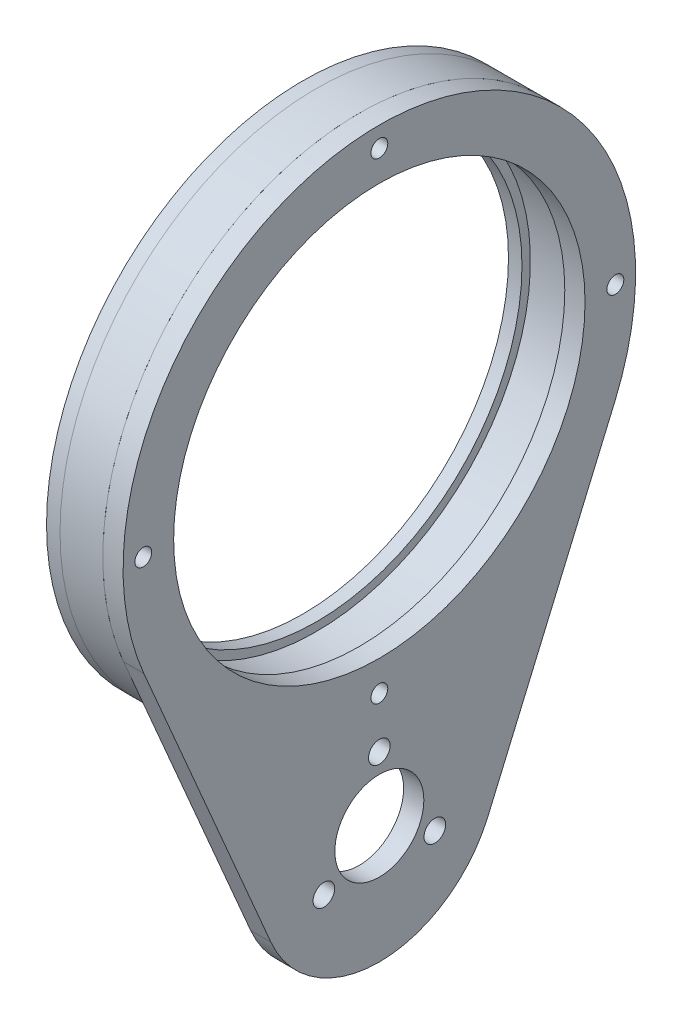
ISO-10303-21;
HEADER;
FILE_DESCRIPTION(('STEP AP214'),'2;1');
FILE_NAME('part.step','',(''),(''),'','','');
FILE_SCHEMA(('AUTOMOTIVE_DESIGN { 1 0 10303 214 1 1 1 1 }'));
ENDSEC;
DATA;
#1=APPLICATION_CONTEXT('core data for automotive mechanical design processes');
#2=APPLICATION_PROTOCOL_DEFINITION('international standard','automotive_design',2000,#1);
#3=PRODUCT_CONTEXT('',#1,'mechanical');
#4=PRODUCT('Part','Part','',(#3));
#5=PRODUCT_RELATED_PRODUCT_CATEGORY('part','',(#4));
#6=PRODUCT_DEFINITION_FORMATION('','',#4);
#7=PRODUCT_DEFINITION_CONTEXT('part definition',#1,'design');
#8=PRODUCT_DEFINITION('design','',#6,#7);
#9=PRODUCT_DEFINITION_SHAPE('','',#8);
#10=(LENGTH_UNIT() NAMED_UNIT(*) SI_UNIT(.MILLI.,.METRE.));
#11=(NAMED_UNIT(*) PLANE_ANGLE_UNIT() SI_UNIT($,.RADIAN.));
#12=(NAMED_UNIT(*) SI_UNIT($,.STERADIAN.) SOLID_ANGLE_UNIT());
#13=UNCERTAINTY_MEASURE_WITH_UNIT(LENGTH_MEASURE(1.E-05),#10,'distance_accuracy_value','');
#14=(GEOMETRIC_REPRESENTATION_CONTEXT(3) GLOBAL_UNCERTAINTY_ASSIGNED_CONTEXT((#13)) GLOBAL_UNIT_ASSIGNED_CONTEXT((#10,
#11,#12)) REPRESENTATION_CONTEXT('',''));
#15=CARTESIAN_POINT('',(0.,0.,0.));
#16=DIRECTION('',(0.,0.,1.));
#17=DIRECTION('',(1.,0.,0.));
#18=AXIS2_PLACEMENT_3D('',#15,#16,#17);
#19=CARTESIAN_POINT('',(-8.35,52.,0.));
#20=DIRECTION('',(-1.,0.,0.));
#21=DIRECTION('',(0.,0.,1.));
#22=AXIS2_PLACEMENT_3D('',#19,#20,#21);
#23=PLANE('',#22);
#24=CARTESIAN_POINT('',(-8.35,52.,-35.));
#25=DIRECTION('',(-1.,0.,0.));
#26=DIRECTION('',(0.,0.,1.));
#27=AXIS2_PLACEMENT_3D('',#24,#25,#26);
#28=CIRCLE('',#27,1.60000000000001);
#29=CARTESIAN_POINT('',(-8.35,52.,-33.4));
#30=VERTEX_POINT('',#29);
#31=EDGE_CURVE('E74',#30,#30,#28,.T.);
#32=ORIENTED_EDGE('',*,*,#31,.F.);
#33=EDGE_LOOP('',(#32));
#34=FACE_BOUND('',#33,.T.);
#35=CARTESIAN_POINT('',(-8.35,17.,0.));
#36=DIRECTION('',(-1.,0.,0.));
#37=DIRECTION('',(0.,0.,1.));
#38=AXIS2_PLACEMENT_3D('',#35,#36,#37);
#39=CIRCLE('',#38,1.6);
#40=CARTESIAN_POINT('',(-8.35,17.,1.6));
#41=VERTEX_POINT('',#40);
#42=EDGE_CURVE('E62',#41,#41,#39,.T.);
#43=ORIENTED_EDGE('',*,*,#42,.F.);
#44=EDGE_LOOP('',(#43));
#45=FACE_BOUND('',#44,.T.);
#46=CARTESIAN_POINT('',(-8.35,52.,0.));
#47=DIRECTION('',(-1.,0.,0.));
#48=DIRECTION('',(0.,0.,1.));
#49=AXIS2_PLACEMENT_3D('',#46,#47,#48);
#50=CIRCLE('',#49,38.);
#51=CARTESIAN_POINT('',(-8.35,52.,38.));
#52=VERTEX_POINT('',#51);
#53=EDGE_CURVE('E11',#52,#52,#50,.T.);
#54=ORIENTED_EDGE('',*,*,#53,.T.);
#55=EDGE_LOOP('',(#54));
#56=FACE_BOUND('',#55,.T.);
#57=CARTESIAN_POINT('',(-8.35,52.,0.));
#58=DIRECTION('',(-1.,0.,0.));
#59=DIRECTION('',(0.,0.,1.));
#60=AXIS2_PLACEMENT_3D('',#57,#58,#59);
#61=CIRCLE('',#60,30.5);
#62=CARTESIAN_POINT('',(-8.35,52.,30.5));
#63=VERTEX_POINT('',#62);
#64=EDGE_CURVE('E57',#63,#63,#61,.T.);
#65=ORIENTED_EDGE('',*,*,#64,.F.);
#66=EDGE_LOOP('',(#65));
#67=FACE_BOUND('',#66,.T.);
#68=CARTESIAN_POINT('',(-8.35,52.,35.));
#69=DIRECTION('',(-1.,0.,0.));
#70=DIRECTION('',(0.,0.,1.));
#71=AXIS2_PLACEMENT_3D('',#68,#69,#70);
#72=CIRCLE('',#71,1.60000000000001);
#73=CARTESIAN_POINT('',(-8.35,52.,36.6));
#74=VERTEX_POINT('',#73);
#75=EDGE_CURVE('E68',#74,#74,#72,.T.);
#76=ORIENTED_EDGE('',*,*,#75,.F.);
#77=EDGE_LOOP('',(#76));
#78=FACE_BOUND('',#77,.T.);
#79=CARTESIAN_POINT('',(-8.35,87.,0.));
#80=DIRECTION('',(-1.,0.,0.));
#81=DIRECTION('',(0.,0.,1.));
#82=AXIS2_PLACEMENT_3D('',#79,#80,#81);
#83=CIRCLE('',#82,1.60000000000001);
#84=CARTESIAN_POINT('',(-8.35,87.,1.60000000000001));
#85=VERTEX_POINT('',#84);
#86=EDGE_CURVE('E80',#85,#85,#83,.T.);
#87=ORIENTED_EDGE('',*,*,#86,.F.);
#88=EDGE_LOOP('',(#87));
#89=FACE_BOUND('',#88,.T.);
#90=ADVANCED_FACE('F46',(#34,#45,#56,#67,#78,#89),#23,.T.);
#91=CARTESIAN_POINT('',(-6.35,52.,0.));
#92=DIRECTION('',(-1.,0.,0.));
#93=DIRECTION('',(0.,0.,1.));
#94=AXIS2_PLACEMENT_3D('',#91,#92,#93);
#95=PLANE('',#94);
#96=CARTESIAN_POINT('',(-6.35,52.,0.));
#97=DIRECTION('',(-1.,0.,0.));
#98=DIRECTION('',(0.,0.,1.));
#99=AXIS2_PLACEMENT_3D('',#96,#97,#98);
#100=CIRCLE('',#99,38.);
#101=CARTESIAN_POINT('',(-6.35,52.,38.));
#102=VERTEX_POINT('',#101);
#103=EDGE_CURVE('E50',#102,#102,#100,.T.);
#104=ORIENTED_EDGE('',*,*,#103,.F.);
#105=EDGE_LOOP('',(#104));
#106=FACE_BOUND('',#105,.T.);
#107=CARTESIAN_POINT('',(-6.35,52.,0.));
#108=DIRECTION('',(-1.,0.,0.));
#109=DIRECTION('',(0.,0.,1.));
#110=AXIS2_PLACEMENT_3D('',#107,#108,#109);
#111=CIRCLE('',#110,30.5);
#112=CARTESIAN_POINT('',(-6.35,52.,30.5));
#113=VERTEX_POINT('',#112);
#114=EDGE_CURVE('E59',#113,#113,#111,.T.);
#115=ORIENTED_EDGE('',*,*,#114,.T.);
#116=EDGE_LOOP('',(#115));
#117=FACE_BOUND('',#116,.T.);
#118=CARTESIAN_POINT('',(-6.35,17.,0.));
#119=DIRECTION('',(-1.,0.,0.));
#120=DIRECTION('',(0.,0.,1.));
#121=AXIS2_PLACEMENT_3D('',#118,#119,#120);
#122=CIRCLE('',#121,1.6);
#123=CARTESIAN_POINT('',(-6.35,17.,1.6));
#124=VERTEX_POINT('',#123);
#125=EDGE_CURVE('E65',#124,#124,#122,.T.);
#126=ORIENTED_EDGE('',*,*,#125,.T.);
#127=EDGE_LOOP('',(#126));
#128=FACE_BOUND('',#127,.T.);
#129=CARTESIAN_POINT('',(-6.35,52.,35.));
#130=DIRECTION('',(-1.,0.,0.));
#131=DIRECTION('',(0.,0.,1.));
#132=AXIS2_PLACEMENT_3D('',#129,#130,#131);
#133=CIRCLE('',#132,1.60000000000001);
#134=CARTESIAN_POINT('',(-6.35,52.,36.6));
#135=VERTEX_POINT('',#134);
#136=EDGE_CURVE('E71',#135,#135,#133,.T.);
#137=ORIENTED_EDGE('',*,*,#136,.T.);
#138=EDGE_LOOP('',(#137));
#139=FACE_BOUND('',#138,.T.);
#140=CARTESIAN_POINT('',(-6.35,52.,-35.));
#141=DIRECTION('',(-1.,0.,0.));
#142=DIRECTION('',(0.,0.,1.));
#143=AXIS2_PLACEMENT_3D('',#140,#141,#142);
#144=CIRCLE('',#143,1.60000000000001);
#145=CARTESIAN_POINT('',(-6.35,52.,-33.4));
#146=VERTEX_POINT('',#145);
#147=EDGE_CURVE('E77',#146,#146,#144,.T.);
#148=ORIENTED_EDGE('',*,*,#147,.T.);
#149=EDGE_LOOP('',(#148));
#150=FACE_BOUND('',#149,.T.);
#151=CARTESIAN_POINT('',(-6.35,87.,0.));
#152=DIRECTION('',(-1.,0.,0.));
#153=DIRECTION('',(0.,0.,1.));
#154=AXIS2_PLACEMENT_3D('',#151,#152,#153);
#155=CIRCLE('',#154,1.60000000000001);
#156=CARTESIAN_POINT('',(-6.35,87.,1.60000000000001));
#157=VERTEX_POINT('',#156);
#158=EDGE_CURVE('E83',#157,#157,#155,.T.);
#159=ORIENTED_EDGE('',*,*,#158,.T.);
#160=EDGE_LOOP('',(#159));
#161=FACE_BOUND('',#160,.T.);
#162=ADVANCED_FACE('F93',(#106,#117,#128,#139,#150,#161),#95,.F.);
#163=CARTESIAN_POINT('',(-8.35,52.,0.));
#164=DIRECTION('',(1.,0.,0.));
#165=DIRECTION('',(0.,0.,-1.));
#166=AXIS2_PLACEMENT_3D('',#163,#164,#165);
#167=CYLINDRICAL_SURFACE('',#166,38.);
#168=ORIENTED_EDGE('',*,*,#53,.F.);
#169=EDGE_LOOP('',(#168));
#170=FACE_BOUND('',#169,.T.);
#171=ORIENTED_EDGE('',*,*,#103,.T.);
#172=EDGE_LOOP('',(#171));
#173=FACE_BOUND('',#172,.T.);
#174=ADVANCED_FACE('F48',(#170,#173),#167,.T.);
#175=CARTESIAN_POINT('',(-8.35,52.,0.));
#176=DIRECTION('',(1.,0.,0.));
#177=DIRECTION('',(0.,0.,-1.));
#178=AXIS2_PLACEMENT_3D('',#175,#176,#177);
#179=CYLINDRICAL_SURFACE('',#178,30.5);
#180=ORIENTED_EDGE('',*,*,#64,.T.);
#181=EDGE_LOOP('',(#180));
#182=FACE_BOUND('',#181,.T.);
#183=ORIENTED_EDGE('',*,*,#114,.F.);
#184=EDGE_LOOP('',(#183));
#185=FACE_BOUND('',#184,.T.);
#186=ADVANCED_FACE('F103',(#182,#185),#179,.F.);
#187=CARTESIAN_POINT('',(-8.35,17.,0.));
#188=DIRECTION('',(1.,0.,0.));
#189=DIRECTION('',(0.,0.,-1.));
#190=AXIS2_PLACEMENT_3D('',#187,#188,#189);
#191=CYLINDRICAL_SURFACE('',#190,1.6);
#192=ORIENTED_EDGE('',*,*,#42,.T.);
#193=EDGE_LOOP('',(#192));
#194=FACE_BOUND('',#193,.T.);
#195=ORIENTED_EDGE('',*,*,#125,.F.);
#196=EDGE_LOOP('',(#195));
#197=FACE_BOUND('',#196,.T.);
#198=ADVANCED_FACE('F106',(#194,#197),#191,.F.);
#199=CARTESIAN_POINT('',(-8.35,52.,35.));
#200=DIRECTION('',(1.,0.,0.));
#201=DIRECTION('',(0.,0.,-1.));
#202=AXIS2_PLACEMENT_3D('',#199,#200,#201);
#203=CYLINDRICAL_SURFACE('',#202,1.60000000000001);
#204=ORIENTED_EDGE('',*,*,#75,.T.);
#205=EDGE_LOOP('',(#204));
#206=FACE_BOUND('',#205,.T.);
#207=ORIENTED_EDGE('',*,*,#136,.F.);
#208=EDGE_LOOP('',(#207));
#209=FACE_BOUND('',#208,.T.);
#210=ADVANCED_FACE('F110',(#206,#209),#203,.F.);
#211=CARTESIAN_POINT('',(-8.35,52.,-35.));
#212=DIRECTION('',(1.,0.,0.));
#213=DIRECTION('',(0.,0.,-1.));
#214=AXIS2_PLACEMENT_3D('',#211,#212,#213);
#215=CYLINDRICAL_SURFACE('',#214,1.60000000000001);
#216=ORIENTED_EDGE('',*,*,#31,.T.);
#217=EDGE_LOOP('',(#216));
#218=FACE_BOUND('',#217,.T.);
#219=ORIENTED_EDGE('',*,*,#147,.F.);
#220=EDGE_LOOP('',(#219));
#221=FACE_BOUND('',#220,.T.);
#222=ADVANCED_FACE('F114',(#218,#221),#215,.F.);
#223=CARTESIAN_POINT('',(-8.35,87.,0.));
#224=DIRECTION('',(1.,0.,0.));
#225=DIRECTION('',(0.,0.,-1.));
#226=AXIS2_PLACEMENT_3D('',#223,#224,#225);
#227=CYLINDRICAL_SURFACE('',#226,1.60000000000001);
#228=ORIENTED_EDGE('',*,*,#86,.T.);
#229=EDGE_LOOP('',(#228));
#230=FACE_BOUND('',#229,.T.);
#231=ORIENTED_EDGE('',*,*,#158,.F.);
#232=EDGE_LOOP('',(#231));
#233=FACE_BOUND('',#232,.T.);
#234=ADVANCED_FACE('F89',(#230,#233),#227,.F.);
#235=CLOSED_SHELL('',(#90,#162,#174,#186,#198,#210,#222,#234));
#236=MANIFOLD_SOLID_BREP('B2',#235);
#237=CARTESIAN_POINT('',(-6.35,52.,0.));
#238=DIRECTION('',(-1.,0.,0.));
#239=DIRECTION('',(0.,0.,1.));
#240=AXIS2_PLACEMENT_3D('',#237,#238,#239);
#241=PLANE('',#240);
#242=CARTESIAN_POINT('',(-6.35,17.,0.));
#243=DIRECTION('',(-1.,0.,0.));
#244=DIRECTION('',(0.,0.,1.));
#245=AXIS2_PLACEMENT_3D('',#242,#243,#244);
#246=CIRCLE('',#245,1.6);
#247=CARTESIAN_POINT('',(-6.35,17.,1.6));
#248=VERTEX_POINT('',#247);
#249=EDGE_CURVE('E229',#248,#248,#246,.T.);
#250=ORIENTED_EDGE('',*,*,#249,.F.);
#251=EDGE_LOOP('',(#250));
#252=FACE_BOUND('',#251,.T.);
#253=CARTESIAN_POINT('',(-6.35,87.,0.));
#254=DIRECTION('',(-1.,0.,0.));
#255=DIRECTION('',(0.,0.,1.));
#256=AXIS2_PLACEMENT_3D('',#253,#254,#255);
#257=CIRCLE('',#256,1.60000000000001);
#258=CARTESIAN_POINT('',(-6.35,87.,1.60000000000001));
#259=VERTEX_POINT('',#258);
#260=EDGE_CURVE('E217',#259,#259,#257,.T.);
#261=ORIENTED_EDGE('',*,*,#260,.F.);
#262=EDGE_LOOP('',(#261));
#263=FACE_BOUND('',#262,.T.);
#264=CARTESIAN_POINT('',(-6.35,52.,0.));
#265=DIRECTION('',(-1.,0.,0.));
#266=DIRECTION('',(0.,0.,1.));
#267=AXIS2_PLACEMENT_3D('',#264,#265,#266);
#268=CIRCLE('',#267,38.);
#269=CARTESIAN_POINT('',(-6.35,52.,38.));
#270=VERTEX_POINT('',#269);
#271=EDGE_CURVE('E45',#270,#270,#268,.T.);
#272=ORIENTED_EDGE('',*,*,#271,.T.);
#273=EDGE_LOOP('',(#272));
#274=FACE_BOUND('',#273,.T.);
#275=CARTESIAN_POINT('',(-6.35,52.,0.));
#276=DIRECTION('',(-1.,0.,0.));
#277=DIRECTION('',(0.,0.,1.));
#278=AXIS2_PLACEMENT_3D('',#275,#276,#277);
#279=CIRCLE('',#278,31.75);
#280=CARTESIAN_POINT('',(-6.35,52.,31.75));
#281=VERTEX_POINT('',#280);
#282=EDGE_CURVE('E212',#281,#281,#279,.T.);
#283=ORIENTED_EDGE('',*,*,#282,.F.);
#284=EDGE_LOOP('',(#283));
#285=FACE_BOUND('',#284,.T.);
#286=CARTESIAN_POINT('',(-6.35,52.,35.));
#287=DIRECTION('',(-1.,0.,0.));
#288=DIRECTION('',(0.,0.,1.));
#289=AXIS2_PLACEMENT_3D('',#286,#287,#288);
#290=CIRCLE('',#289,1.60000000000001);
#291=CARTESIAN_POINT('',(-6.35,52.,36.6));
#292=VERTEX_POINT('',#291);
#293=EDGE_CURVE('E223',#292,#292,#290,.T.);
#294=ORIENTED_EDGE('',*,*,#293,.F.);
#295=EDGE_LOOP('',(#294));
#296=FACE_BOUND('',#295,.T.);
#297=CARTESIAN_POINT('',(-6.35,52.,-35.));
#298=DIRECTION('',(-1.,0.,0.));
#299=DIRECTION('',(0.,0.,1.));
#300=AXIS2_PLACEMENT_3D('',#297,#298,#299);
#301=CIRCLE('',#300,1.60000000000001);
#302=CARTESIAN_POINT('',(-6.35,52.,-33.4));
#303=VERTEX_POINT('',#302);
#304=EDGE_CURVE('E235',#303,#303,#301,.T.);
#305=ORIENTED_EDGE('',*,*,#304,.F.);
#306=EDGE_LOOP('',(#305));
#307=FACE_BOUND('',#306,.T.);
#308=ADVANCED_FACE('F201',(#252,#263,#274,#285,#296,#307),#241,.T.);
#309=CARTESIAN_POINT('',(0.,52.,0.));
#310=DIRECTION('',(-1.,0.,0.));
#311=DIRECTION('',(0.,0.,1.));
#312=AXIS2_PLACEMENT_3D('',#309,#310,#311);
#313=PLANE('',#312);
#314=CARTESIAN_POINT('',(0.,52.,0.));
#315=DIRECTION('',(-1.,0.,0.));
#316=DIRECTION('',(0.,0.,1.));
#317=AXIS2_PLACEMENT_3D('',#314,#315,#316);
#318=CIRCLE('',#317,38.);
#319=CARTESIAN_POINT('',(0.,52.,38.));
#320=VERTEX_POINT('',#319);
#321=EDGE_CURVE('E205',#320,#320,#318,.T.);
#322=ORIENTED_EDGE('',*,*,#321,.F.);
#323=EDGE_LOOP('',(#322));
#324=FACE_BOUND('',#323,.T.);
#325=CARTESIAN_POINT('',(0.,52.,0.));
#326=DIRECTION('',(-1.,0.,0.));
#327=DIRECTION('',(0.,0.,1.));
#328=AXIS2_PLACEMENT_3D('',#325,#326,#327);
#329=CIRCLE('',#328,31.75);
#330=CARTESIAN_POINT('',(0.,52.,31.75));
#331=VERTEX_POINT('',#330);
#332=EDGE_CURVE('E214',#331,#331,#329,.T.);
#333=ORIENTED_EDGE('',*,*,#332,.T.);
#334=EDGE_LOOP('',(#333));
#335=FACE_BOUND('',#334,.T.);
#336=CARTESIAN_POINT('',(0.,87.,0.));
#337=DIRECTION('',(-1.,0.,0.));
#338=DIRECTION('',(0.,0.,1.));
#339=AXIS2_PLACEMENT_3D('',#336,#337,#338);
#340=CIRCLE('',#339,1.60000000000001);
#341=CARTESIAN_POINT('',(0.,87.,1.60000000000001));
#342=VERTEX_POINT('',#341);
#343=EDGE_CURVE('E220',#342,#342,#340,.T.);
#344=ORIENTED_EDGE('',*,*,#343,.T.);
#345=EDGE_LOOP('',(#344));
#346=FACE_BOUND('',#345,.T.);
#347=CARTESIAN_POINT('',(0.,52.,35.));
#348=DIRECTION('',(-1.,0.,0.));
#349=DIRECTION('',(0.,0.,1.));
#350=AXIS2_PLACEMENT_3D('',#347,#348,#349);
#351=CIRCLE('',#350,1.60000000000001);
#352=CARTESIAN_POINT('',(0.,52.,36.6));
#353=VERTEX_POINT('',#352);
#354=EDGE_CURVE('E226',#353,#353,#351,.T.);
#355=ORIENTED_EDGE('',*,*,#354,.T.);
#356=EDGE_LOOP('',(#355));
#357=FACE_BOUND('',#356,.T.);
#358=CARTESIAN_POINT('',(0.,17.,0.));
#359=DIRECTION('',(-1.,0.,0.));
#360=DIRECTION('',(0.,0.,1.));
#361=AXIS2_PLACEMENT_3D('',#358,#359,#360);
#362=CIRCLE('',#361,1.6);
#363=CARTESIAN_POINT('',(0.,17.,1.6));
#364=VERTEX_POINT('',#363);
#365=EDGE_CURVE('E232',#364,#364,#362,.T.);
#366=ORIENTED_EDGE('',*,*,#365,.T.);
#367=EDGE_LOOP('',(#366));
#368=FACE_BOUND('',#367,.T.);
#369=CARTESIAN_POINT('',(0.,52.,-35.));
#370=DIRECTION('',(-1.,0.,0.));
#371=DIRECTION('',(0.,0.,1.));
#372=AXIS2_PLACEMENT_3D('',#369,#370,#371);
#373=CIRCLE('',#372,1.60000000000001);
#374=CARTESIAN_POINT('',(0.,52.,-33.4));
#375=VERTEX_POINT('',#374);
#376=EDGE_CURVE('E238',#375,#375,#373,.T.);
#377=ORIENTED_EDGE('',*,*,#376,.T.);
#378=EDGE_LOOP('',(#377));
#379=FACE_BOUND('',#378,.T.);
#380=ADVANCED_FACE('F248',(#324,#335,#346,#357,#368,#379),#313,.F.);
#381=CARTESIAN_POINT('',(-6.35,52.,0.));
#382=DIRECTION('',(1.,0.,0.));
#383=DIRECTION('',(0.,0.,-1.));
#384=AXIS2_PLACEMENT_3D('',#381,#382,#383);
#385=CYLINDRICAL_SURFACE('',#384,38.);
#386=ORIENTED_EDGE('',*,*,#271,.F.);
#387=EDGE_LOOP('',(#386));
#388=FACE_BOUND('',#387,.T.);
#389=ORIENTED_EDGE('',*,*,#321,.T.);
#390=EDGE_LOOP('',(#389));
#391=FACE_BOUND('',#390,.T.);
#392=ADVANCED_FACE('F203',(#388,#391),#385,.T.);
#393=CARTESIAN_POINT('',(-6.35,52.,0.));
#394=DIRECTION('',(1.,0.,0.));
#395=DIRECTION('',(0.,0.,-1.));
#396=AXIS2_PLACEMENT_3D('',#393,#394,#395);
#397=CYLINDRICAL_SURFACE('',#396,31.75);
#398=ORIENTED_EDGE('',*,*,#282,.T.);
#399=EDGE_LOOP('',(#398));
#400=FACE_BOUND('',#399,.T.);
#401=ORIENTED_EDGE('',*,*,#332,.F.);
#402=EDGE_LOOP('',(#401));
#403=FACE_BOUND('',#402,.T.);
#404=ADVANCED_FACE('F258',(#400,#403),#397,.F.);
#405=CARTESIAN_POINT('',(-6.35,87.,0.));
#406=DIRECTION('',(1.,0.,0.));
#407=DIRECTION('',(0.,0.,-1.));
#408=AXIS2_PLACEMENT_3D('',#405,#406,#407);
#409=CYLINDRICAL_SURFACE('',#408,1.60000000000001);
#410=ORIENTED_EDGE('',*,*,#260,.T.);
#411=EDGE_LOOP('',(#410));
#412=FACE_BOUND('',#411,.T.);
#413=ORIENTED_EDGE('',*,*,#343,.F.);
#414=EDGE_LOOP('',(#413));
#415=FACE_BOUND('',#414,.T.);
#416=ADVANCED_FACE('F261',(#412,#415),#409,.F.);
#417=CARTESIAN_POINT('',(-6.35,52.,35.));
#418=DIRECTION('',(1.,0.,0.));
#419=DIRECTION('',(0.,0.,-1.));
#420=AXIS2_PLACEMENT_3D('',#417,#418,#419);
#421=CYLINDRICAL_SURFACE('',#420,1.60000000000001);
#422=ORIENTED_EDGE('',*,*,#293,.T.);
#423=EDGE_LOOP('',(#422));
#424=FACE_BOUND('',#423,.T.);
#425=ORIENTED_EDGE('',*,*,#354,.F.);
#426=EDGE_LOOP('',(#425));
#427=FACE_BOUND('',#426,.T.);
#428=ADVANCED_FACE('F265',(#424,#427),#421,.F.);
#429=CARTESIAN_POINT('',(-6.35,17.,0.));
#430=DIRECTION('',(1.,0.,0.));
#431=DIRECTION('',(0.,0.,-1.));
#432=AXIS2_PLACEMENT_3D('',#429,#430,#431);
#433=CYLINDRICAL_SURFACE('',#432,1.6);
#434=ORIENTED_EDGE('',*,*,#249,.T.);
#435=EDGE_LOOP('',(#434));
#436=FACE_BOUND('',#435,.T.);
#437=ORIENTED_EDGE('',*,*,#365,.F.);
#438=EDGE_LOOP('',(#437));
#439=FACE_BOUND('',#438,.T.);
#440=ADVANCED_FACE('F269',(#436,#439),#433,.F.);
#441=CARTESIAN_POINT('',(-6.35,52.,-35.));
#442=DIRECTION('',(1.,0.,0.));
#443=DIRECTION('',(0.,0.,-1.));
#444=AXIS2_PLACEMENT_3D('',#441,#442,#443);
#445=CYLINDRICAL_SURFACE('',#444,1.60000000000001);
#446=ORIENTED_EDGE('',*,*,#304,.T.);
#447=EDGE_LOOP('',(#446));
#448=FACE_BOUND('',#447,.T.);
#449=ORIENTED_EDGE('',*,*,#376,.F.);
#450=EDGE_LOOP('',(#449));
#451=FACE_BOUND('',#450,.T.);
#452=ADVANCED_FACE('F244',(#448,#451),#445,.F.);
#453=CLOSED_SHELL('',(#308,#380,#392,#404,#416,#428,#440,#452));
#454=MANIFOLD_SOLID_BREP('B6',#453);
#455=CARTESIAN_POINT('',(3.,52.,0.));
#456=DIRECTION('',(1.,0.,0.));
#457=DIRECTION('',(0.,0.,-1.));
#458=AXIS2_PLACEMENT_3D('',#455,#456,#457);
#459=PLANE('',#458);
#460=CARTESIAN_POINT('',(3.,52.,-35.));
#461=DIRECTION('',(1.,0.,0.));
#462=DIRECTION('',(0.,0.,-1.));
#463=AXIS2_PLACEMENT_3D('',#460,#461,#462);
#464=CIRCLE('',#463,1.25);
#465=CARTESIAN_POINT('',(3.,52.,-36.25));
#466=VERTEX_POINT('',#465);
#467=EDGE_CURVE('E465',#466,#466,#464,.T.);
#468=ORIENTED_EDGE('',*,*,#467,.F.);
#469=EDGE_LOOP('',(#468));
#470=FACE_BOUND('',#469,.T.);
#471=CARTESIAN_POINT('',(3.,87.,0.));
#472=DIRECTION('',(1.,0.,0.));
#473=DIRECTION('',(0.,0.,-1.));
#474=AXIS2_PLACEMENT_3D('',#471,#472,#473);
#475=CIRCLE('',#474,1.25);
#476=CARTESIAN_POINT('',(3.,87.,-1.25));
#477=VERTEX_POINT('',#476);
#478=EDGE_CURVE('E453',#477,#477,#475,.T.);
#479=ORIENTED_EDGE('',*,*,#478,.F.);
#480=EDGE_LOOP('',(#479));
#481=FACE_BOUND('',#480,.T.);
#482=CARTESIAN_POINT('',(3.,-4.75,8.22724133595217));
#483=DIRECTION('',(1.,0.,0.));
#484=DIRECTION('',(0.,0.,-1.));
#485=AXIS2_PLACEMENT_3D('',#482,#483,#484);
#486=CIRCLE('',#485,1.6);
#487=CARTESIAN_POINT('',(3.,-4.75,6.62724133595217));
#488=VERTEX_POINT('',#487);
#489=EDGE_CURVE('E441',#488,#488,#486,.T.);
#490=ORIENTED_EDGE('',*,*,#489,.F.);
#491=EDGE_LOOP('',(#490));
#492=FACE_BOUND('',#491,.T.);
#493=CARTESIAN_POINT('',(3.,9.5,0.));
#494=DIRECTION('',(1.,0.,0.));
#495=DIRECTION('',(0.,0.,-1.));
#496=AXIS2_PLACEMENT_3D('',#493,#494,#495);
#497=CIRCLE('',#496,1.6);
#498=CARTESIAN_POINT('',(3.,9.5,-1.6));
#499=VERTEX_POINT('',#498);
#500=EDGE_CURVE('E429',#499,#499,#497,.T.);
#501=ORIENTED_EDGE('',*,*,#500,.F.);
#502=EDGE_LOOP('',(#501));
#503=FACE_BOUND('',#502,.T.);
#504=CARTESIAN_POINT('',(3.,52.,0.));
#505=DIRECTION('',(1.,0.,0.));
#506=DIRECTION('',(0.,0.,-1.));
#507=AXIS2_PLACEMENT_3D('',#504,#505,#506);
#508=CIRCLE('',#507,38.);
#509=CARTESIAN_POINT('',(3.,37.0192307692307,-34.9224362445468));
#510=VERTEX_POINT('',#509);
#511=CARTESIAN_POINT('',(3.,37.0192307692307,34.9224362445468));
#512=VERTEX_POINT('',#511);
#513=EDGE_CURVE('E399',#510,#512,#508,.T.);
#514=ORIENTED_EDGE('',*,*,#513,.T.);
#515=DIRECTION('',(0.,-0.919011480119653,-0.39423076923077));
#516=VECTOR('',#515,1.);
#517=CARTESIAN_POINT('',(3.,37.0192307692307,34.9224362445468));
#518=LINE('',#517,#516);
#519=CARTESIAN_POINT('',(3.,-6.89903846153846,16.0827009020939));
#520=VERTEX_POINT('',#519);
#521=EDGE_CURVE('E394',#512,#520,#518,.T.);
#522=ORIENTED_EDGE('',*,*,#521,.T.);
#523=CARTESIAN_POINT('',(3.,0.,0.));
#524=DIRECTION('',(1.,0.,0.));
#525=DIRECTION('',(0.,0.,-1.));
#526=AXIS2_PLACEMENT_3D('',#523,#524,#525);
#527=CIRCLE('',#526,17.5);
#528=CARTESIAN_POINT('',(3.,-6.89903846153847,-16.0827009020939));
#529=VERTEX_POINT('',#528);
#530=EDGE_CURVE('E397',#520,#529,#527,.T.);
#531=ORIENTED_EDGE('',*,*,#530,.T.);
#532=DIRECTION('',(0.,0.919011480119653,-0.39423076923077));
#533=VECTOR('',#532,1.);
#534=CARTESIAN_POINT('',(3.,37.0192307692307,-34.9224362445468));
#535=LINE('',#534,#533);
#536=EDGE_CURVE('E364',#529,#510,#535,.T.);
#537=ORIENTED_EDGE('',*,*,#536,.T.);
#538=EDGE_LOOP('',(#514,#522,#531,#537));
#539=FACE_BOUND('',#538,.T.);
#540=CARTESIAN_POINT('',(3.,0.,0.));
#541=DIRECTION('',(1.,0.,0.));
#542=DIRECTION('',(0.,0.,-1.));
#543=AXIS2_PLACEMENT_3D('',#540,#541,#542);
#544=CIRCLE('',#543,6.6);
#545=CARTESIAN_POINT('',(3.,0.,-6.6));
#546=VERTEX_POINT('',#545);
#547=EDGE_CURVE('E414',#546,#546,#544,.T.);
#548=ORIENTED_EDGE('',*,*,#547,.F.);
#549=EDGE_LOOP('',(#548));
#550=FACE_BOUND('',#549,.T.);
#551=CARTESIAN_POINT('',(3.,-4.75,-8.22724133595217));
#552=DIRECTION('',(1.,0.,0.));
#553=DIRECTION('',(0.,0.,-1.));
#554=AXIS2_PLACEMENT_3D('',#551,#552,#553);
#555=CIRCLE('',#554,1.6);
#556=CARTESIAN_POINT('',(3.,-4.75,-9.82724133595217));
#557=VERTEX_POINT('',#556);
#558=EDGE_CURVE('E435',#557,#557,#555,.T.);
#559=ORIENTED_EDGE('',*,*,#558,.F.);
#560=EDGE_LOOP('',(#559));
#561=FACE_BOUND('',#560,.T.);
#562=CARTESIAN_POINT('',(3.,52.,0.));
#563=DIRECTION('',(1.,0.,0.));
#564=DIRECTION('',(0.,0.,-1.));
#565=AXIS2_PLACEMENT_3D('',#562,#563,#564);
#566=CIRCLE('',#565,30.5);
#567=CARTESIAN_POINT('',(3.,52.,-30.5));
#568=VERTEX_POINT('',#567);
#569=EDGE_CURVE('E447',#568,#568,#566,.T.);
#570=ORIENTED_EDGE('',*,*,#569,.F.);
#571=EDGE_LOOP('',(#570));
#572=FACE_BOUND('',#571,.T.);
#573=CARTESIAN_POINT('',(3.,17.,0.));
#574=DIRECTION('',(1.,0.,0.));
#575=DIRECTION('',(0.,0.,-1.));
#576=AXIS2_PLACEMENT_3D('',#573,#574,#575);
#577=CIRCLE('',#576,1.25);
#578=CARTESIAN_POINT('',(3.,17.,-1.25));
#579=VERTEX_POINT('',#578);
#580=EDGE_CURVE('E459',#579,#579,#577,.T.);
#581=ORIENTED_EDGE('',*,*,#580,.F.);
#582=EDGE_LOOP('',(#581));
#583=FACE_BOUND('',#582,.T.);
#584=CARTESIAN_POINT('',(3.,52.,35.));
#585=DIRECTION('',(1.,0.,0.));
#586=DIRECTION('',(0.,0.,-1.));
#587=AXIS2_PLACEMENT_3D('',#584,#585,#586);
#588=CIRCLE('',#587,1.25);
#589=CARTESIAN_POINT('',(3.,52.,33.75));
#590=VERTEX_POINT('',#589);
#591=EDGE_CURVE('E471',#590,#590,#588,.T.);
#592=ORIENTED_EDGE('',*,*,#591,.F.);
#593=EDGE_LOOP('',(#592));
#594=FACE_BOUND('',#593,.T.);
#595=ADVANCED_FACE('F347',(#470,#481,#492,#503,#539,#550,#561,#572,#583,#594),#459,.T.);
#596=CARTESIAN_POINT('',(0.,52.,0.));
#597=DIRECTION('',(1.,0.,0.));
#598=DIRECTION('',(0.,0.,-1.));
#599=AXIS2_PLACEMENT_3D('',#596,#597,#598);
#600=PLANE('',#599);
#601=CARTESIAN_POINT('',(0.,52.,0.));
#602=DIRECTION('',(1.,0.,0.));
#603=DIRECTION('',(0.,0.,-1.));
#604=AXIS2_PLACEMENT_3D('',#601,#602,#603);
#605=CIRCLE('',#604,38.);
#606=CARTESIAN_POINT('',(0.,37.0192307692307,-34.9224362445468));
#607=VERTEX_POINT('',#606);
#608=CARTESIAN_POINT('',(0.,37.0192307692307,34.9224362445468));
#609=VERTEX_POINT('',#608);
#610=EDGE_CURVE('E411',#607,#609,#605,.T.);
#611=ORIENTED_EDGE('',*,*,#610,.F.);
#612=DIRECTION('',(0.,0.919011480119653,-0.39423076923077));
#613=VECTOR('',#612,1.);
#614=CARTESIAN_POINT('',(0.,37.0192307692307,-34.9224362445468));
#615=LINE('',#614,#613);
#616=CARTESIAN_POINT('',(0.,-6.89903846153847,-16.0827009020939));
#617=VERTEX_POINT('',#616);
#618=EDGE_CURVE('E387',#617,#607,#615,.T.);
#619=ORIENTED_EDGE('',*,*,#618,.F.);
#620=CARTESIAN_POINT('',(0.,0.,0.));
#621=DIRECTION('',(1.,0.,0.));
#622=DIRECTION('',(0.,0.,-1.));
#623=AXIS2_PLACEMENT_3D('',#620,#621,#622);
#624=CIRCLE('',#623,17.5);
#625=CARTESIAN_POINT('',(0.,-6.89903846153846,16.0827009020939));
#626=VERTEX_POINT('',#625);
#627=EDGE_CURVE('E381',#626,#617,#624,.T.);
#628=ORIENTED_EDGE('',*,*,#627,.F.);
#629=DIRECTION('',(0.,-0.919011480119653,-0.39423076923077));
#630=VECTOR('',#629,1.);
#631=CARTESIAN_POINT('',(0.,37.0192307692307,34.9224362445468));
#632=LINE('',#631,#630);
#633=EDGE_CURVE('E403',#609,#626,#632,.T.);
#634=ORIENTED_EDGE('',*,*,#633,.F.);
#635=EDGE_LOOP('',(#611,#619,#628,#634));
#636=FACE_BOUND('',#635,.T.);
#637=CARTESIAN_POINT('',(0.,0.,0.));
#638=DIRECTION('',(1.,0.,0.));
#639=DIRECTION('',(0.,0.,-1.));
#640=AXIS2_PLACEMENT_3D('',#637,#638,#639);
#641=CIRCLE('',#640,6.6);
#642=CARTESIAN_POINT('',(0.,0.,-6.6));
#643=VERTEX_POINT('',#642);
#644=EDGE_CURVE('E426',#643,#643,#641,.T.);
#645=ORIENTED_EDGE('',*,*,#644,.T.);
#646=EDGE_LOOP('',(#645));
#647=FACE_BOUND('',#646,.T.);
#648=CARTESIAN_POINT('',(0.,9.5,0.));
#649=DIRECTION('',(1.,0.,0.));
#650=DIRECTION('',(0.,0.,-1.));
#651=AXIS2_PLACEMENT_3D('',#648,#649,#650);
#652=CIRCLE('',#651,1.6);
#653=CARTESIAN_POINT('',(0.,9.5,-1.6));
#654=VERTEX_POINT('',#653);
#655=EDGE_CURVE('E432',#654,#654,#652,.T.);
#656=ORIENTED_EDGE('',*,*,#655,.T.);
#657=EDGE_LOOP('',(#656));
#658=FACE_BOUND('',#657,.T.);
#659=CARTESIAN_POINT('',(0.,-4.75,-8.22724133595217));
#660=DIRECTION('',(1.,0.,0.));
#661=DIRECTION('',(0.,0.,-1.));
#662=AXIS2_PLACEMENT_3D('',#659,#660,#661);
#663=CIRCLE('',#662,1.6);
#664=CARTESIAN_POINT('',(0.,-4.75,-9.82724133595217));
#665=VERTEX_POINT('',#664);
#666=EDGE_CURVE('E438',#665,#665,#663,.T.);
#667=ORIENTED_EDGE('',*,*,#666,.T.);
#668=EDGE_LOOP('',(#667));
#669=FACE_BOUND('',#668,.T.);
#670=CARTESIAN_POINT('',(0.,-4.75,8.22724133595217));
#671=DIRECTION('',(1.,0.,0.));
#672=DIRECTION('',(0.,0.,-1.));
#673=AXIS2_PLACEMENT_3D('',#670,#671,#672);
#674=CIRCLE('',#673,1.6);
#675=CARTESIAN_POINT('',(0.,-4.75,6.62724133595217));
#676=VERTEX_POINT('',#675);
#677=EDGE_CURVE('E444',#676,#676,#674,.T.);
#678=ORIENTED_EDGE('',*,*,#677,.T.);
#679=EDGE_LOOP('',(#678));
#680=FACE_BOUND('',#679,.T.);
#681=CARTESIAN_POINT('',(0.,52.,0.));
#682=DIRECTION('',(1.,0.,0.));
#683=DIRECTION('',(0.,0.,-1.));
#684=AXIS2_PLACEMENT_3D('',#681,#682,#683);
#685=CIRCLE('',#684,30.5);
#686=CARTESIAN_POINT('',(0.,52.,-30.5));
#687=VERTEX_POINT('',#686);
#688=EDGE_CURVE('E450',#687,#687,#685,.T.);
#689=ORIENTED_EDGE('',*,*,#688,.T.);
#690=EDGE_LOOP('',(#689));
#691=FACE_BOUND('',#690,.T.);
#692=CARTESIAN_POINT('',(0.,87.,0.));
#693=DIRECTION('',(1.,0.,0.));
#694=DIRECTION('',(0.,0.,-1.));
#695=AXIS2_PLACEMENT_3D('',#692,#693,#694);
#696=CIRCLE('',#695,1.25);
#697=CARTESIAN_POINT('',(0.,87.,-1.25));
#698=VERTEX_POINT('',#697);
#699=EDGE_CURVE('E456',#698,#698,#696,.T.);
#700=ORIENTED_EDGE('',*,*,#699,.T.);
#701=EDGE_LOOP('',(#700));
#702=FACE_BOUND('',#701,.T.);
#703=CARTESIAN_POINT('',(0.,17.,0.));
#704=DIRECTION('',(1.,0.,0.));
#705=DIRECTION('',(0.,0.,-1.));
#706=AXIS2_PLACEMENT_3D('',#703,#704,#705);
#707=CIRCLE('',#706,1.25);
#708=CARTESIAN_POINT('',(0.,17.,-1.25));
#709=VERTEX_POINT('',#708);
#710=EDGE_CURVE('E462',#709,#709,#707,.T.);
#711=ORIENTED_EDGE('',*,*,#710,.T.);
#712=EDGE_LOOP('',(#711));
#713=FACE_BOUND('',#712,.T.);
#714=CARTESIAN_POINT('',(0.,52.,-35.));
#715=DIRECTION('',(1.,0.,0.));
#716=DIRECTION('',(0.,0.,-1.));
#717=AXIS2_PLACEMENT_3D('',#714,#715,#716);
#718=CIRCLE('',#717,1.25);
#719=CARTESIAN_POINT('',(0.,52.,-36.25));
#720=VERTEX_POINT('',#719);
#721=EDGE_CURVE('E468',#720,#720,#718,.T.);
#722=ORIENTED_EDGE('',*,*,#721,.T.);
#723=EDGE_LOOP('',(#722));
#724=FACE_BOUND('',#723,.T.);
#725=CARTESIAN_POINT('',(0.,52.,35.));
#726=DIRECTION('',(1.,0.,0.));
#727=DIRECTION('',(0.,0.,-1.));
#728=AXIS2_PLACEMENT_3D('',#725,#726,#727);
#729=CIRCLE('',#728,1.25);
#730=CARTESIAN_POINT('',(0.,52.,33.75));
#731=VERTEX_POINT('',#730);
#732=EDGE_CURVE('E474',#731,#731,#729,.T.);
#733=ORIENTED_EDGE('',*,*,#732,.T.);
#734=EDGE_LOOP('',(#733));
#735=FACE_BOUND('',#734,.T.);
#736=ADVANCED_FACE('F422',(#636,#647,#658,#669,#680,#691,#702,#713,#724,#735),#600,.F.);
#737=CARTESIAN_POINT('',(3.,52.,0.));
#738=DIRECTION('',(-1.,0.,0.));
#739=DIRECTION('',(0.,0.,1.));
#740=AXIS2_PLACEMENT_3D('',#737,#738,#739);
#741=CYLINDRICAL_SURFACE('',#740,38.);
#742=ORIENTED_EDGE('',*,*,#610,.T.);
#743=DIRECTION('',(-1.,0.,0.));
#744=VECTOR('',#743,1.);
#745=CARTESIAN_POINT('',(3.,37.0192307692307,34.9224362445468));
#746=LINE('',#745,#744);
#747=EDGE_CURVE('E199',#512,#609,#746,.T.);
#748=ORIENTED_EDGE('',*,*,#747,.F.);
#749=ORIENTED_EDGE('',*,*,#513,.F.);
#750=DIRECTION('',(-1.,0.,0.));
#751=VECTOR('',#750,1.);
#752=CARTESIAN_POINT('',(3.,37.0192307692307,-34.9224362445468));
#753=LINE('',#752,#751);
#754=EDGE_CURVE('E407',#510,#607,#753,.T.);
#755=ORIENTED_EDGE('',*,*,#754,.T.);
#756=EDGE_LOOP('',(#742,#748,#749,#755));
#757=FACE_BOUND('',#756,.T.);
#758=ADVANCED_FACE('F349',(#757),#741,.T.);
#759=CARTESIAN_POINT('',(3.,37.0192307692307,34.9224362445468));
#760=DIRECTION('',(0.,0.39423076923077,-0.919011480119653));
#761=DIRECTION('',(0.,0.919011480119653,0.39423076923077));
#762=AXIS2_PLACEMENT_3D('',#759,#760,#761);
#763=PLANE('',#762);
#764=ORIENTED_EDGE('',*,*,#633,.T.);
#765=DIRECTION('',(-1.,0.,0.));
#766=VECTOR('',#765,1.);
#767=CARTESIAN_POINT('',(3.,-6.89903846153846,16.0827009020939));
#768=LINE('',#767,#766);
#769=EDGE_CURVE('E356',#520,#626,#768,.T.);
#770=ORIENTED_EDGE('',*,*,#769,.F.);
#771=ORIENTED_EDGE('',*,*,#521,.F.);
#772=ORIENTED_EDGE('',*,*,#747,.T.);
#773=EDGE_LOOP('',(#764,#770,#771,#772));
#774=FACE_BOUND('',#773,.T.);
#775=ADVANCED_FACE('F402',(#774),#763,.F.);
#776=CARTESIAN_POINT('',(3.,0.,0.));
#777=DIRECTION('',(-1.,0.,0.));
#778=DIRECTION('',(0.,0.,1.));
#779=AXIS2_PLACEMENT_3D('',#776,#777,#778);
#780=CYLINDRICAL_SURFACE('',#779,17.5);
#781=ORIENTED_EDGE('',*,*,#627,.T.);
#782=DIRECTION('',(-1.,0.,0.));
#783=VECTOR('',#782,1.);
#784=CARTESIAN_POINT('',(3.,-6.89903846153847,-16.0827009020939));
#785=LINE('',#784,#783);
#786=EDGE_CURVE('E404',#529,#617,#785,.T.);
#787=ORIENTED_EDGE('',*,*,#786,.F.);
#788=ORIENTED_EDGE('',*,*,#530,.F.);
#789=ORIENTED_EDGE('',*,*,#769,.T.);
#790=EDGE_LOOP('',(#781,#787,#788,#789));
#791=FACE_BOUND('',#790,.T.);
#792=ADVANCED_FACE('F405',(#791),#780,.T.);
#793=CARTESIAN_POINT('',(3.,37.0192307692307,-34.9224362445468));
#794=DIRECTION('',(0.,0.39423076923077,0.919011480119653));
#795=DIRECTION('',(0.,-0.919011480119653,0.39423076923077));
#796=AXIS2_PLACEMENT_3D('',#793,#794,#795);
#797=PLANE('',#796);
#798=ORIENTED_EDGE('',*,*,#618,.T.);
#799=ORIENTED_EDGE('',*,*,#754,.F.);
#800=ORIENTED_EDGE('',*,*,#536,.F.);
#801=ORIENTED_EDGE('',*,*,#786,.T.);
#802=EDGE_LOOP('',(#798,#799,#800,#801));
#803=FACE_BOUND('',#802,.T.);
#804=ADVANCED_FACE('F419',(#803),#797,.F.);
#805=CARTESIAN_POINT('',(3.,0.,0.));
#806=DIRECTION('',(-1.,0.,0.));
#807=DIRECTION('',(0.,0.,1.));
#808=AXIS2_PLACEMENT_3D('',#805,#806,#807);
#809=CYLINDRICAL_SURFACE('',#808,6.6);
#810=ORIENTED_EDGE('',*,*,#547,.T.);
#811=EDGE_LOOP('',(#810));
#812=FACE_BOUND('',#811,.T.);
#813=ORIENTED_EDGE('',*,*,#644,.F.);
#814=EDGE_LOOP('',(#813));
#815=FACE_BOUND('',#814,.T.);
#816=ADVANCED_FACE('F493',(#812,#815),#809,.F.);
#817=CARTESIAN_POINT('',(3.,9.5,0.));
#818=DIRECTION('',(-1.,0.,0.));
#819=DIRECTION('',(0.,0.,1.));
#820=AXIS2_PLACEMENT_3D('',#817,#818,#819);
#821=CYLINDRICAL_SURFACE('',#820,1.6);
#822=ORIENTED_EDGE('',*,*,#500,.T.);
#823=EDGE_LOOP('',(#822));
#824=FACE_BOUND('',#823,.T.);
#825=ORIENTED_EDGE('',*,*,#655,.F.);
#826=EDGE_LOOP('',(#825));
#827=FACE_BOUND('',#826,.T.);
#828=ADVANCED_FACE('F539',(#824,#827),#821,.F.);
#829=CARTESIAN_POINT('',(3.,-4.75,-8.22724133595217));
#830=DIRECTION('',(-1.,0.,0.));
#831=DIRECTION('',(0.,0.,1.));
#832=AXIS2_PLACEMENT_3D('',#829,#830,#831);
#833=CYLINDRICAL_SURFACE('',#832,1.6);
#834=ORIENTED_EDGE('',*,*,#558,.T.);
#835=EDGE_LOOP('',(#834));
#836=FACE_BOUND('',#835,.T.);
#837=ORIENTED_EDGE('',*,*,#666,.F.);
#838=EDGE_LOOP('',(#837));
#839=FACE_BOUND('',#838,.T.);
#840=ADVANCED_FACE('F547',(#836,#839),#833,.F.);
#841=CARTESIAN_POINT('',(3.,-4.75,8.22724133595217));
#842=DIRECTION('',(-1.,0.,0.));
#843=DIRECTION('',(0.,0.,1.));
#844=AXIS2_PLACEMENT_3D('',#841,#842,#843);
#845=CYLINDRICAL_SURFACE('',#844,1.6);
#846=ORIENTED_EDGE('',*,*,#489,.T.);
#847=EDGE_LOOP('',(#846));
#848=FACE_BOUND('',#847,.T.);
#849=ORIENTED_EDGE('',*,*,#677,.F.);
#850=EDGE_LOOP('',(#849));
#851=FACE_BOUND('',#850,.T.);
#852=ADVANCED_FACE('F555',(#848,#851),#845,.F.);
#853=CARTESIAN_POINT('',(3.,52.,0.));
#854=DIRECTION('',(-1.,0.,0.));
#855=DIRECTION('',(0.,0.,1.));
#856=AXIS2_PLACEMENT_3D('',#853,#854,#855);
#857=CYLINDRICAL_SURFACE('',#856,30.5);
#858=ORIENTED_EDGE('',*,*,#569,.T.);
#859=EDGE_LOOP('',(#858));
#860=FACE_BOUND('',#859,.T.);
#861=ORIENTED_EDGE('',*,*,#688,.F.);
#862=EDGE_LOOP('',(#861));
#863=FACE_BOUND('',#862,.T.);
#864=ADVANCED_FACE('F564',(#860,#863),#857,.F.);
#865=CARTESIAN_POINT('',(3.,87.,0.));
#866=DIRECTION('',(-1.,0.,0.));
#867=DIRECTION('',(0.,0.,1.));
#868=AXIS2_PLACEMENT_3D('',#865,#866,#867);
#869=CYLINDRICAL_SURFACE('',#868,1.25);
#870=ORIENTED_EDGE('',*,*,#478,.T.);
#871=EDGE_LOOP('',(#870));
#872=FACE_BOUND('',#871,.T.);
#873=ORIENTED_EDGE('',*,*,#699,.F.);
#874=EDGE_LOOP('',(#873));
#875=FACE_BOUND('',#874,.T.);
#876=ADVANCED_FACE('F573',(#872,#875),#869,.F.);
#877=CARTESIAN_POINT('',(3.,17.,0.));
#878=DIRECTION('',(-1.,0.,0.));
#879=DIRECTION('',(0.,0.,1.));
#880=AXIS2_PLACEMENT_3D('',#877,#878,#879);
#881=CYLINDRICAL_SURFACE('',#880,1.25);
#882=ORIENTED_EDGE('',*,*,#580,.T.);
#883=EDGE_LOOP('',(#882));
#884=FACE_BOUND('',#883,.T.);
#885=ORIENTED_EDGE('',*,*,#710,.F.);
#886=EDGE_LOOP('',(#885));
#887=FACE_BOUND('',#886,.T.);
#888=ADVANCED_FACE('F582',(#884,#887),#881,.F.);
#889=CARTESIAN_POINT('',(3.,52.,-35.));
#890=DIRECTION('',(-1.,0.,0.));
#891=DIRECTION('',(0.,0.,1.));
#892=AXIS2_PLACEMENT_3D('',#889,#890,#891);
#893=CYLINDRICAL_SURFACE('',#892,1.25);
#894=ORIENTED_EDGE('',*,*,#467,.T.);
#895=EDGE_LOOP('',(#894));
#896=FACE_BOUND('',#895,.T.);
#897=ORIENTED_EDGE('',*,*,#721,.F.);
#898=EDGE_LOOP('',(#897));
#899=FACE_BOUND('',#898,.T.);
#900=ADVANCED_FACE('F591',(#896,#899),#893,.F.);
#901=CARTESIAN_POINT('',(3.,52.,35.));
#902=DIRECTION('',(-1.,0.,0.));
#903=DIRECTION('',(0.,0.,1.));
#904=AXIS2_PLACEMENT_3D('',#901,#902,#903);
#905=CYLINDRICAL_SURFACE('',#904,1.25);
#906=ORIENTED_EDGE('',*,*,#591,.T.);
#907=EDGE_LOOP('',(#906));
#908=FACE_BOUND('',#907,.T.);
#909=ORIENTED_EDGE('',*,*,#732,.F.);
#910=EDGE_LOOP('',(#909));
#911=FACE_BOUND('',#910,.T.);
#912=ADVANCED_FACE('F480',(#908,#911),#905,.F.);
#913=CLOSED_SHELL('',(#595,#736,#758,#775,#792,#804,#816,#828,#840,#852,#864,#876,#888,#900,#912));
#914=MANIFOLD_SOLID_BREP('B40',#913);
#915=ADVANCED_BREP_SHAPE_REPRESENTATION('',(#18,#236,#454,#914),#14);
#916=SHAPE_DEFINITION_REPRESENTATION(#9,#915);
ENDSEC;
END-ISO-10303-21;
